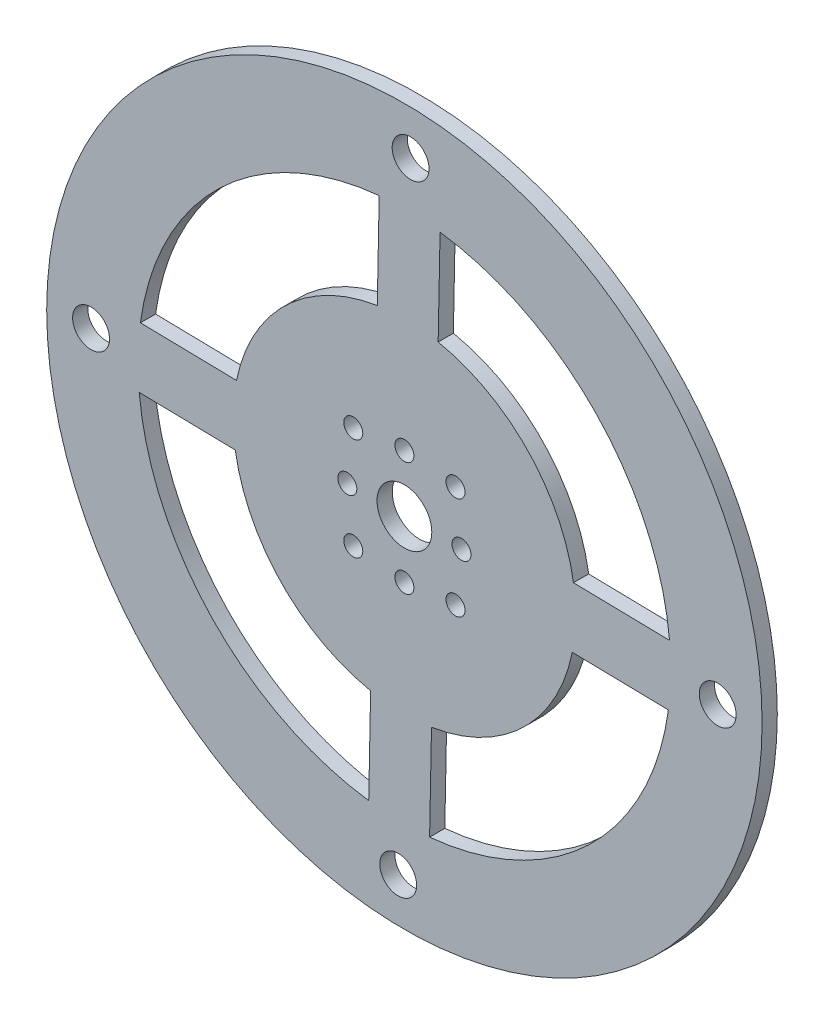
ISO-10303-21;
HEADER;
FILE_DESCRIPTION(('STEP AP214'),'2;1');
FILE_NAME('part.step','',(''),(''),'','','');
FILE_SCHEMA(('AUTOMOTIVE_DESIGN { 1 0 10303 214 1 1 1 1 }'));
ENDSEC;
DATA;
#1=APPLICATION_CONTEXT('core data for automotive mechanical design processes');
#2=APPLICATION_PROTOCOL_DEFINITION('international standard','automotive_design',2000,#1);
#3=PRODUCT_CONTEXT('',#1,'mechanical');
#4=PRODUCT('Part','Part','',(#3));
#5=PRODUCT_RELATED_PRODUCT_CATEGORY('part','',(#4));
#6=PRODUCT_DEFINITION_FORMATION('','',#4);
#7=PRODUCT_DEFINITION_CONTEXT('part definition',#1,'design');
#8=PRODUCT_DEFINITION('design','',#6,#7);
#9=PRODUCT_DEFINITION_SHAPE('','',#8);
#10=(LENGTH_UNIT() NAMED_UNIT(*) SI_UNIT(.MILLI.,.METRE.));
#11=(NAMED_UNIT(*) PLANE_ANGLE_UNIT() SI_UNIT($,.RADIAN.));
#12=(NAMED_UNIT(*) SI_UNIT($,.STERADIAN.) SOLID_ANGLE_UNIT());
#13=UNCERTAINTY_MEASURE_WITH_UNIT(LENGTH_MEASURE(1.E-05),#10,'distance_accuracy_value','');
#14=(GEOMETRIC_REPRESENTATION_CONTEXT(3) GLOBAL_UNCERTAINTY_ASSIGNED_CONTEXT((#13)) GLOBAL_UNIT_ASSIGNED_CONTEXT((#10,
#11,#12)) REPRESENTATION_CONTEXT('',''));
#15=CARTESIAN_POINT('',(0.,0.,0.));
#16=DIRECTION('',(0.,0.,1.));
#17=DIRECTION('',(1.,0.,0.));
#18=AXIS2_PLACEMENT_3D('',#15,#16,#17);
#19=CARTESIAN_POINT('',(0.,-1.2991317006536E-12,2.));
#20=DIRECTION('',(0.,0.,-1.));
#21=DIRECTION('',(-1.,0.,0.));
#22=AXIS2_PLACEMENT_3D('',#19,#20,#21);
#23=CYLINDRICAL_SURFACE('',#22,22.5);
#24=CARTESIAN_POINT('',(0.,-1.2991317006536E-12,0.));
#25=DIRECTION('',(0.,0.,1.));
#26=DIRECTION('',(1.,0.,0.));
#27=AXIS2_PLACEMENT_3D('',#24,#25,#26);
#28=CIRCLE('',#27,22.5);
#29=CARTESIAN_POINT('',(22.2163059498012,3.56170604413365,0.));
#30=VERTEX_POINT('',#29);
#31=CARTESIAN_POINT('',(4.43673200749201,22.0582276961146,0.));
#32=VERTEX_POINT('',#31);
#33=EDGE_CURVE('E326',#30,#32,#28,.T.);
#34=ORIENTED_EDGE('',*,*,#33,.T.);
#35=DIRECTION('',(0.,0.,-1.));
#36=VECTOR('',#35,1.);
#37=CARTESIAN_POINT('',(4.43673200749201,22.0582276961146,2.));
#38=LINE('',#37,#36);
#39=CARTESIAN_POINT('',(4.43673200749201,22.0582276961146,2.));
#40=VERTEX_POINT('',#39);
#41=EDGE_CURVE('E11',#40,#32,#38,.T.);
#42=ORIENTED_EDGE('',*,*,#41,.F.);
#43=CARTESIAN_POINT('',(0.,-1.2991317006536E-12,2.));
#44=DIRECTION('',(0.,0.,1.));
#45=DIRECTION('',(1.,0.,0.));
#46=AXIS2_PLACEMENT_3D('',#43,#44,#45);
#47=CIRCLE('',#46,22.5);
#48=CARTESIAN_POINT('',(22.2163059498012,3.56170604413365,2.));
#49=VERTEX_POINT('',#48);
#50=EDGE_CURVE('E186',#49,#40,#47,.T.);
#51=ORIENTED_EDGE('',*,*,#50,.F.);
#52=DIRECTION('',(0.,0.,-1.));
#53=VECTOR('',#52,1.);
#54=CARTESIAN_POINT('',(22.2163059498012,3.56170604413365,2.));
#55=LINE('',#54,#53);
#56=EDGE_CURVE('E69',#49,#30,#55,.T.);
#57=ORIENTED_EDGE('',*,*,#56,.T.);
#58=EDGE_LOOP('',(#34,#42,#51,#57));
#59=FACE_BOUND('',#58,.T.);
#60=ADVANCED_FACE('F49',(#59),#23,.T.);
#61=CARTESIAN_POINT('',(3.99921902581342,-0.0790391268426525,2.));
#62=DIRECTION('',(0.999804756453352,-0.0197597817106631,0.));
#63=DIRECTION('',(0.0197597817106631,0.999804756453352,0.));
#64=AXIS2_PLACEMENT_3D('',#61,#62,#63);
#65=PLANE('',#64);
#66=DIRECTION('',(-0.0197597817106631,-0.999804756453352,0.));
#67=VECTOR('',#66,1.);
#68=CARTESIAN_POINT('',(3.99921902581342,-0.0790391268426525,0.));
#69=LINE('',#68,#67);
#70=CARTESIAN_POINT('',(4.68628001922159,34.6848494242284,0.));
#71=VERTEX_POINT('',#70);
#72=EDGE_CURVE('E174',#71,#32,#69,.T.);
#73=ORIENTED_EDGE('',*,*,#72,.F.);
#74=DIRECTION('',(0.,0.,-1.));
#75=VECTOR('',#74,1.);
#76=CARTESIAN_POINT('',(4.68628001922159,34.6848494242284,2.));
#77=LINE('',#76,#75);
#78=CARTESIAN_POINT('',(4.68628001922159,34.6848494242284,2.));
#79=VERTEX_POINT('',#78);
#80=EDGE_CURVE('E60',#79,#71,#77,.T.);
#81=ORIENTED_EDGE('',*,*,#80,.F.);
#82=DIRECTION('',(-0.0197597817106631,-0.999804756453352,0.));
#83=VECTOR('',#82,1.);
#84=CARTESIAN_POINT('',(3.99921902581342,-0.0790391268426525,2.));
#85=LINE('',#84,#83);
#86=EDGE_CURVE('E172',#79,#40,#85,.T.);
#87=ORIENTED_EDGE('',*,*,#86,.T.);
#88=ORIENTED_EDGE('',*,*,#41,.T.);
#89=EDGE_LOOP('',(#73,#81,#87,#88));
#90=FACE_BOUND('',#89,.T.);
#91=ADVANCED_FACE('F171',(#90),#65,.T.);
#92=CARTESIAN_POINT('',(0.,0.,2.));
#93=DIRECTION('',(0.,0.,-1.));
#94=DIRECTION('',(-1.,0.,0.));
#95=AXIS2_PLACEMENT_3D('',#92,#93,#94);
#96=CYLINDRICAL_SURFACE('',#95,35.);
#97=CARTESIAN_POINT('',(0.,0.,0.));
#98=DIRECTION('',(0.,0.,1.));
#99=DIRECTION('',(1.,0.,0.));
#100=AXIS2_PLACEMENT_3D('',#97,#98,#99);
#101=CIRCLE('',#100,35.);
#102=CARTESIAN_POINT('',(34.8429276779144,3.31215803240416,0.));
#103=VERTEX_POINT('',#102);
#104=EDGE_CURVE('E316',#103,#71,#101,.T.);
#105=ORIENTED_EDGE('',*,*,#104,.F.);
#106=DIRECTION('',(0.,0.,-1.));
#107=VECTOR('',#106,1.);
#108=CARTESIAN_POINT('',(34.8429276779144,3.31215803240416,2.));
#109=LINE('',#108,#107);
#110=CARTESIAN_POINT('',(34.8429276779144,3.31215803240416,2.));
#111=VERTEX_POINT('',#110);
#112=EDGE_CURVE('E118',#111,#103,#109,.T.);
#113=ORIENTED_EDGE('',*,*,#112,.F.);
#114=CARTESIAN_POINT('',(0.,0.,2.));
#115=DIRECTION('',(0.,0.,1.));
#116=DIRECTION('',(1.,0.,0.));
#117=AXIS2_PLACEMENT_3D('',#114,#115,#116);
#118=CIRCLE('',#117,35.);
#119=EDGE_CURVE('E185',#111,#79,#118,.T.);
#120=ORIENTED_EDGE('',*,*,#119,.T.);
#121=ORIENTED_EDGE('',*,*,#80,.T.);
#122=EDGE_LOOP('',(#105,#113,#120,#121));
#123=FACE_BOUND('',#122,.T.);
#124=ADVANCED_FACE('F190',(#123),#96,.F.);
#125=CARTESIAN_POINT('',(-3.31215803240538,34.8429276779138,0.));
#126=VERTEX_POINT('',#125);
#127=CARTESIAN_POINT('',(-34.6848494242292,4.68628001922039,0.));
#128=VERTEX_POINT('',#127);
#129=EDGE_CURVE('E339',#126,#128,#101,.T.);
#130=ORIENTED_EDGE('',*,*,#129,.F.);
#131=DIRECTION('',(0.,0.,-1.));
#132=VECTOR('',#131,1.);
#133=CARTESIAN_POINT('',(-3.31215803240538,34.8429276779138,2.));
#134=LINE('',#133,#132);
#135=CARTESIAN_POINT('',(-3.31215803240538,34.8429276779138,2.));
#136=VERTEX_POINT('',#135);
#137=EDGE_CURVE('E406',#136,#126,#134,.T.);
#138=ORIENTED_EDGE('',*,*,#137,.F.);
#139=CARTESIAN_POINT('',(-34.6848494242292,4.68628001922039,2.));
#140=VERTEX_POINT('',#139);
#141=EDGE_CURVE('E194',#136,#140,#118,.T.);
#142=ORIENTED_EDGE('',*,*,#141,.T.);
#143=DIRECTION('',(0.,0.,-1.));
#144=VECTOR('',#143,1.);
#145=CARTESIAN_POINT('',(-34.6848494242292,4.68628001922039,2.));
#146=LINE('',#145,#144);
#147=EDGE_CURVE('E408',#140,#128,#146,.T.);
#148=ORIENTED_EDGE('',*,*,#147,.T.);
#149=EDGE_LOOP('',(#130,#138,#142,#148));
#150=FACE_BOUND('',#149,.T.);
#151=ADVANCED_FACE('F485',(#150),#96,.F.);
#152=CARTESIAN_POINT('',(-3.99921902581341,0.0790391268426523,2.));
#153=DIRECTION('',(-0.999804756453352,0.0197597817106631,0.));
#154=DIRECTION('',(-0.0197597817106631,-0.999804756453352,0.));
#155=AXIS2_PLACEMENT_3D('',#152,#153,#154);
#156=PLANE('',#155);
#157=DIRECTION('',(0.0197597817106631,0.999804756453352,0.));
#158=VECTOR('',#157,1.);
#159=CARTESIAN_POINT('',(-3.99921902581341,0.0790391268426523,0.));
#160=LINE('',#159,#158);
#161=CARTESIAN_POINT('',(-3.56170604413482,22.2163059497999,0.));
#162=VERTEX_POINT('',#161);
#163=EDGE_CURVE('E340',#162,#126,#160,.T.);
#164=ORIENTED_EDGE('',*,*,#163,.F.);
#165=DIRECTION('',(0.,0.,-1.));
#166=VECTOR('',#165,1.);
#167=CARTESIAN_POINT('',(-3.56170604413482,22.2163059497999,2.));
#168=LINE('',#167,#166);
#169=CARTESIAN_POINT('',(-3.56170604413482,22.2163059497999,2.));
#170=VERTEX_POINT('',#169);
#171=EDGE_CURVE('E414',#170,#162,#168,.T.);
#172=ORIENTED_EDGE('',*,*,#171,.F.);
#173=DIRECTION('',(0.0197597817106631,0.999804756453352,0.));
#174=VECTOR('',#173,1.);
#175=CARTESIAN_POINT('',(-3.99921902581341,0.0790391268426523,2.));
#176=LINE('',#175,#174);
#177=EDGE_CURVE('E205',#170,#136,#176,.T.);
#178=ORIENTED_EDGE('',*,*,#177,.T.);
#179=ORIENTED_EDGE('',*,*,#137,.T.);
#180=EDGE_LOOP('',(#164,#172,#178,#179));
#181=FACE_BOUND('',#180,.T.);
#182=ADVANCED_FACE('F477',(#181),#156,.T.);
#183=CARTESIAN_POINT('',(-22.0582276961159,4.43673200749088,0.));
#184=VERTEX_POINT('',#183);
#185=EDGE_CURVE('E344',#162,#184,#28,.T.);
#186=ORIENTED_EDGE('',*,*,#185,.T.);
#187=DIRECTION('',(0.,0.,-1.));
#188=VECTOR('',#187,1.);
#189=CARTESIAN_POINT('',(-22.0582276961159,4.43673200749088,2.));
#190=LINE('',#189,#188);
#191=CARTESIAN_POINT('',(-22.0582276961159,4.43673200749088,2.));
#192=VERTEX_POINT('',#191);
#193=EDGE_CURVE('E410',#192,#184,#190,.T.);
#194=ORIENTED_EDGE('',*,*,#193,.F.);
#195=EDGE_CURVE('E251',#170,#192,#47,.T.);
#196=ORIENTED_EDGE('',*,*,#195,.F.);
#197=ORIENTED_EDGE('',*,*,#171,.T.);
#198=EDGE_LOOP('',(#186,#194,#196,#197));
#199=FACE_BOUND('',#198,.T.);
#200=ADVANCED_FACE('F466',(#199),#23,.T.);
#201=CARTESIAN_POINT('',(-34.8429276779144,-3.31215803240644,0.));
#202=VERTEX_POINT('',#201);
#203=CARTESIAN_POINT('',(-4.68628001922146,-34.6848494242298,0.));
#204=VERTEX_POINT('',#203);
#205=EDGE_CURVE('E317',#202,#204,#101,.T.);
#206=ORIENTED_EDGE('',*,*,#205,.F.);
#207=DIRECTION('',(0.,0.,-1.));
#208=VECTOR('',#207,1.);
#209=CARTESIAN_POINT('',(-34.8429276779144,-3.31215803240644,2.));
#210=LINE('',#209,#208);
#211=CARTESIAN_POINT('',(-34.8429276779144,-3.31215803240644,2.));
#212=VERTEX_POINT('',#211);
#213=EDGE_CURVE('E411',#212,#202,#210,.T.);
#214=ORIENTED_EDGE('',*,*,#213,.F.);
#215=CARTESIAN_POINT('',(-4.68628001922146,-34.6848494242298,2.));
#216=VERTEX_POINT('',#215);
#217=EDGE_CURVE('E207',#212,#216,#118,.T.);
#218=ORIENTED_EDGE('',*,*,#217,.T.);
#219=DIRECTION('',(0.,0.,-1.));
#220=VECTOR('',#219,1.);
#221=CARTESIAN_POINT('',(-4.68628001922146,-34.6848494242298,2.));
#222=LINE('',#221,#220);
#223=EDGE_CURVE('E419',#216,#204,#222,.T.);
#224=ORIENTED_EDGE('',*,*,#223,.T.);
#225=EDGE_LOOP('',(#206,#214,#218,#224));
#226=FACE_BOUND('',#225,.T.);
#227=ADVANCED_FACE('F476',(#226),#96,.F.);
#228=CARTESIAN_POINT('',(-0.0790391268426754,-3.99921902581456,2.));
#229=DIRECTION('',(-0.0197597817106632,-0.999804756453352,0.));
#230=DIRECTION('',(0.999804756453352,-0.0197597817106632,0.));
#231=AXIS2_PLACEMENT_3D('',#228,#229,#230);
#232=PLANE('',#231);
#233=DIRECTION('',(-0.999804756453352,0.0197597817106632,0.));
#234=VECTOR('',#233,1.);
#235=CARTESIAN_POINT('',(-0.0790391268426754,-3.99921902581456,0.));
#236=LINE('',#235,#234);
#237=CARTESIAN_POINT('',(-22.2163059498013,-3.56170604413594,0.));
#238=VERTEX_POINT('',#237);
#239=EDGE_CURVE('E331',#238,#202,#236,.T.);
#240=ORIENTED_EDGE('',*,*,#239,.F.);
#241=DIRECTION('',(0.,0.,-1.));
#242=VECTOR('',#241,1.);
#243=CARTESIAN_POINT('',(-22.2163059498013,-3.56170604413594,2.));
#244=LINE('',#243,#242);
#245=CARTESIAN_POINT('',(-22.2163059498013,-3.56170604413594,2.));
#246=VERTEX_POINT('',#245);
#247=EDGE_CURVE('E425',#246,#238,#244,.T.);
#248=ORIENTED_EDGE('',*,*,#247,.F.);
#249=DIRECTION('',(-0.999804756453352,0.0197597817106632,0.));
#250=VECTOR('',#249,1.);
#251=CARTESIAN_POINT('',(-0.0790391268426754,-3.99921902581456,2.));
#252=LINE('',#251,#250);
#253=EDGE_CURVE('E223',#246,#212,#252,.T.);
#254=ORIENTED_EDGE('',*,*,#253,.T.);
#255=ORIENTED_EDGE('',*,*,#213,.T.);
#256=EDGE_LOOP('',(#240,#248,#254,#255));
#257=FACE_BOUND('',#256,.T.);
#258=ADVANCED_FACE('F483',(#257),#232,.T.);
#259=CARTESIAN_POINT('',(-4.43673200749204,-22.0582276961172,0.));
#260=VERTEX_POINT('',#259);
#261=EDGE_CURVE('E327',#238,#260,#28,.T.);
#262=ORIENTED_EDGE('',*,*,#261,.T.);
#263=DIRECTION('',(0.,0.,-1.));
#264=VECTOR('',#263,1.);
#265=CARTESIAN_POINT('',(-4.43673200749204,-22.0582276961172,2.));
#266=LINE('',#265,#264);
#267=CARTESIAN_POINT('',(-4.43673200749204,-22.0582276961172,2.));
#268=VERTEX_POINT('',#267);
#269=EDGE_CURVE('E422',#268,#260,#266,.T.);
#270=ORIENTED_EDGE('',*,*,#269,.F.);
#271=EDGE_CURVE('E233',#246,#268,#47,.T.);
#272=ORIENTED_EDGE('',*,*,#271,.F.);
#273=ORIENTED_EDGE('',*,*,#247,.T.);
#274=EDGE_LOOP('',(#262,#270,#272,#273));
#275=FACE_BOUND('',#274,.T.);
#276=ADVANCED_FACE('F474',(#275),#23,.T.);
#277=CARTESIAN_POINT('',(3.31215803240521,-34.8429276779151,0.));
#278=VERTEX_POINT('',#277);
#279=CARTESIAN_POINT('',(34.684849424229,-4.68628001922266,0.));
#280=VERTEX_POINT('',#279);
#281=EDGE_CURVE('E312',#278,#280,#101,.T.);
#282=ORIENTED_EDGE('',*,*,#281,.F.);
#283=DIRECTION('',(0.,0.,-1.));
#284=VECTOR('',#283,1.);
#285=CARTESIAN_POINT('',(3.31215803240521,-34.8429276779151,2.));
#286=LINE('',#285,#284);
#287=CARTESIAN_POINT('',(3.31215803240521,-34.8429276779151,2.));
#288=VERTEX_POINT('',#287);
#289=EDGE_CURVE('E53',#288,#278,#286,.T.);
#290=ORIENTED_EDGE('',*,*,#289,.F.);
#291=CARTESIAN_POINT('',(34.684849424229,-4.68628001922266,2.));
#292=VERTEX_POINT('',#291);
#293=EDGE_CURVE('E195',#288,#292,#118,.T.);
#294=ORIENTED_EDGE('',*,*,#293,.T.);
#295=DIRECTION('',(0.,0.,-1.));
#296=VECTOR('',#295,1.);
#297=CARTESIAN_POINT('',(34.684849424229,-4.68628001922266,2.));
#298=LINE('',#297,#296);
#299=EDGE_CURVE('E311',#292,#280,#298,.T.);
#300=ORIENTED_EDGE('',*,*,#299,.T.);
#301=EDGE_LOOP('',(#282,#290,#294,#300));
#302=FACE_BOUND('',#301,.T.);
#303=ADVANCED_FACE('F443',(#302),#96,.F.);
#304=CARTESIAN_POINT('',(3.99921902581341,-0.0790391268426524,2.));
#305=DIRECTION('',(0.999804756453352,-0.0197597817106631,0.));
#306=DIRECTION('',(0.0197597817106631,0.999804756453352,0.));
#307=AXIS2_PLACEMENT_3D('',#304,#305,#306);
#308=PLANE('',#307);
#309=DIRECTION('',(-0.0197597817106631,-0.999804756453352,0.));
#310=VECTOR('',#309,1.);
#311=CARTESIAN_POINT('',(3.99921902581341,-0.0790391268426524,0.));
#312=LINE('',#311,#310);
#313=CARTESIAN_POINT('',(3.56170604413478,-22.2163059498025,0.));
#314=VERTEX_POINT('',#313);
#315=EDGE_CURVE('E315',#314,#278,#312,.T.);
#316=ORIENTED_EDGE('',*,*,#315,.F.);
#317=DIRECTION('',(0.,0.,-1.));
#318=VECTOR('',#317,1.);
#319=CARTESIAN_POINT('',(3.56170604413478,-22.2163059498025,2.));
#320=LINE('',#319,#318);
#321=CARTESIAN_POINT('',(3.56170604413478,-22.2163059498025,2.));
#322=VERTEX_POINT('',#321);
#323=EDGE_CURVE('E434',#322,#314,#320,.T.);
#324=ORIENTED_EDGE('',*,*,#323,.F.);
#325=DIRECTION('',(-0.0197597817106631,-0.999804756453352,0.));
#326=VECTOR('',#325,1.);
#327=CARTESIAN_POINT('',(3.99921902581341,-0.0790391268426524,2.));
#328=LINE('',#327,#326);
#329=EDGE_CURVE('E209',#322,#288,#328,.T.);
#330=ORIENTED_EDGE('',*,*,#329,.T.);
#331=ORIENTED_EDGE('',*,*,#289,.T.);
#332=EDGE_LOOP('',(#316,#324,#330,#331));
#333=FACE_BOUND('',#332,.T.);
#334=ADVANCED_FACE('F51',(#333),#308,.T.);
#335=CARTESIAN_POINT('',(22.0582276961159,-4.43673200749317,0.));
#336=VERTEX_POINT('',#335);
#337=EDGE_CURVE('E321',#314,#336,#28,.T.);
#338=ORIENTED_EDGE('',*,*,#337,.T.);
#339=DIRECTION('',(0.,0.,-1.));
#340=VECTOR('',#339,1.);
#341=CARTESIAN_POINT('',(22.0582276961159,-4.43673200749317,2.));
#342=LINE('',#341,#340);
#343=CARTESIAN_POINT('',(22.0582276961159,-4.43673200749317,2.));
#344=VERTEX_POINT('',#343);
#345=EDGE_CURVE('E432',#344,#336,#342,.T.);
#346=ORIENTED_EDGE('',*,*,#345,.F.);
#347=EDGE_CURVE('E216',#322,#344,#47,.T.);
#348=ORIENTED_EDGE('',*,*,#347,.F.);
#349=ORIENTED_EDGE('',*,*,#323,.T.);
#350=EDGE_LOOP('',(#338,#346,#348,#349));
#351=FACE_BOUND('',#350,.T.);
#352=ADVANCED_FACE('F449',(#351),#23,.T.);
#353=CARTESIAN_POINT('',(-41.1669608469668,0.813609011935407,2.));
#354=DIRECTION('',(0.,0.,-1.));
#355=DIRECTION('',(-1.,0.,0.));
#356=AXIS2_PLACEMENT_3D('',#353,#354,#355);
#357=CYLINDRICAL_SURFACE('',#356,2.425);
#358=CARTESIAN_POINT('',(-41.1669608469668,0.813609011935407,2.));
#359=DIRECTION('',(0.,0.,1.));
#360=DIRECTION('',(1.,0.,0.));
#361=AXIS2_PLACEMENT_3D('',#358,#359,#360);
#362=CIRCLE('',#361,2.425);
#363=CARTESIAN_POINT('',(-38.7419608469668,0.813609011935407,2.));
#364=VERTEX_POINT('',#363);
#365=EDGE_CURVE('E303',#364,#364,#362,.T.);
#366=ORIENTED_EDGE('',*,*,#365,.T.);
#367=EDGE_LOOP('',(#366));
#368=FACE_BOUND('',#367,.T.);
#369=CARTESIAN_POINT('',(-41.1669608469668,0.813609011935407,0.));
#370=DIRECTION('',(0.,0.,1.));
#371=DIRECTION('',(1.,0.,0.));
#372=AXIS2_PLACEMENT_3D('',#369,#370,#371);
#373=CIRCLE('',#372,2.425);
#374=CARTESIAN_POINT('',(-38.7419608469668,0.813609011935407,0.));
#375=VERTEX_POINT('',#374);
#376=EDGE_CURVE('E219',#375,#375,#373,.T.);
#377=ORIENTED_EDGE('',*,*,#376,.F.);
#378=EDGE_LOOP('',(#377));
#379=FACE_BOUND('',#378,.T.);
#380=ADVANCED_FACE('F473',(#368,#379),#357,.F.);
#381=CARTESIAN_POINT('',(41.1669608469668,-0.813609011938273,2.));
#382=DIRECTION('',(0.,0.,-1.));
#383=DIRECTION('',(-1.,0.,0.));
#384=AXIS2_PLACEMENT_3D('',#381,#382,#383);
#385=CYLINDRICAL_SURFACE('',#384,2.425);
#386=CARTESIAN_POINT('',(41.1669608469668,-0.813609011938273,2.));
#387=DIRECTION('',(0.,0.,1.));
#388=DIRECTION('',(1.,0.,0.));
#389=AXIS2_PLACEMENT_3D('',#386,#387,#388);
#390=CIRCLE('',#389,2.425);
#391=CARTESIAN_POINT('',(43.5919608469667,-0.813609011938273,2.));
#392=VERTEX_POINT('',#391);
#393=EDGE_CURVE('E299',#392,#392,#390,.T.);
#394=ORIENTED_EDGE('',*,*,#393,.T.);
#395=EDGE_LOOP('',(#394));
#396=FACE_BOUND('',#395,.T.);
#397=CARTESIAN_POINT('',(41.1669608469668,-0.813609011938273,0.));
#398=DIRECTION('',(0.,0.,1.));
#399=DIRECTION('',(1.,0.,0.));
#400=AXIS2_PLACEMENT_3D('',#397,#398,#399);
#401=CIRCLE('',#400,2.425);
#402=CARTESIAN_POINT('',(43.5919608469667,-0.813609011938273,0.));
#403=VERTEX_POINT('',#402);
#404=EDGE_CURVE('E397',#403,#403,#401,.T.);
#405=ORIENTED_EDGE('',*,*,#404,.F.);
#406=EDGE_LOOP('',(#405));
#407=FACE_BOUND('',#406,.T.);
#408=ADVANCED_FACE('F653',(#396,#407),#385,.F.);
#409=CARTESIAN_POINT('',(0.81360901193682,41.1669608469655,2.));
#410=DIRECTION('',(0.,0.,-1.));
#411=DIRECTION('',(-1.,0.,0.));
#412=AXIS2_PLACEMENT_3D('',#409,#410,#411);
#413=CYLINDRICAL_SURFACE('',#412,2.42499999999999);
#414=CARTESIAN_POINT('',(0.81360901193682,41.1669608469655,2.));
#415=DIRECTION('',(0.,0.,1.));
#416=DIRECTION('',(1.,0.,0.));
#417=AXIS2_PLACEMENT_3D('',#414,#415,#416);
#418=CIRCLE('',#417,2.42499999999999);
#419=CARTESIAN_POINT('',(3.23860901193681,41.1669608469655,2.));
#420=VERTEX_POINT('',#419);
#421=EDGE_CURVE('E295',#420,#420,#418,.T.);
#422=ORIENTED_EDGE('',*,*,#421,.T.);
#423=EDGE_LOOP('',(#422));
#424=FACE_BOUND('',#423,.T.);
#425=CARTESIAN_POINT('',(0.81360901193682,41.1669608469655,0.));
#426=DIRECTION('',(0.,0.,1.));
#427=DIRECTION('',(1.,0.,0.));
#428=AXIS2_PLACEMENT_3D('',#425,#426,#427);
#429=CIRCLE('',#428,2.42499999999999);
#430=CARTESIAN_POINT('',(3.23860901193681,41.1669608469655,0.));
#431=VERTEX_POINT('',#430);
#432=EDGE_CURVE('E393',#431,#431,#429,.T.);
#433=ORIENTED_EDGE('',*,*,#432,.F.);
#434=EDGE_LOOP('',(#433));
#435=FACE_BOUND('',#434,.T.);
#436=ADVANCED_FACE('F657',(#424,#435),#413,.F.);
#437=CARTESIAN_POINT('',(-0.813609011936573,-41.1669608469681,2.));
#438=DIRECTION('',(0.,0.,-1.));
#439=DIRECTION('',(-1.,0.,0.));
#440=AXIS2_PLACEMENT_3D('',#437,#438,#439);
#441=CYLINDRICAL_SURFACE('',#440,2.42499999999999);
#442=CARTESIAN_POINT('',(-0.813609011936573,-41.1669608469681,2.));
#443=DIRECTION('',(0.,0.,1.));
#444=DIRECTION('',(1.,0.,0.));
#445=AXIS2_PLACEMENT_3D('',#442,#443,#444);
#446=CIRCLE('',#445,2.42499999999999);
#447=CARTESIAN_POINT('',(1.61139098806342,-41.1669608469681,2.));
#448=VERTEX_POINT('',#447);
#449=EDGE_CURVE('E291',#448,#448,#446,.T.);
#450=ORIENTED_EDGE('',*,*,#449,.T.);
#451=EDGE_LOOP('',(#450));
#452=FACE_BOUND('',#451,.T.);
#453=CARTESIAN_POINT('',(-0.813609011936573,-41.1669608469681,0.));
#454=DIRECTION('',(0.,0.,1.));
#455=DIRECTION('',(1.,0.,0.));
#456=AXIS2_PLACEMENT_3D('',#453,#454,#455);
#457=CIRCLE('',#456,2.42499999999999);
#458=CARTESIAN_POINT('',(1.61139098806342,-41.1669608469681,0.));
#459=VERTEX_POINT('',#458);
#460=EDGE_CURVE('E389',#459,#459,#457,.T.);
#461=ORIENTED_EDGE('',*,*,#460,.F.);
#462=EDGE_LOOP('',(#461));
#463=FACE_BOUND('',#462,.T.);
#464=ADVANCED_FACE('F661',(#452,#463),#441,.F.);
#465=CARTESIAN_POINT('',(0.,-1.2991317006536E-12,2.));
#466=DIRECTION('',(0.,0.,-1.));
#467=DIRECTION('',(-1.,0.,0.));
#468=AXIS2_PLACEMENT_3D('',#465,#466,#467);
#469=CYLINDRICAL_SURFACE('',#468,3.6);
#470=CARTESIAN_POINT('',(0.,-1.2991317006536E-12,2.));
#471=DIRECTION('',(0.,0.,1.));
#472=DIRECTION('',(1.,0.,0.));
#473=AXIS2_PLACEMENT_3D('',#470,#471,#472);
#474=CIRCLE('',#473,3.6);
#475=CARTESIAN_POINT('',(3.59999999999997,-1.2991317006536E-12,2.));
#476=VERTEX_POINT('',#475);
#477=EDGE_CURVE('E287',#476,#476,#474,.F.);
#478=ORIENTED_EDGE('',*,*,#477,.F.);
#479=EDGE_LOOP('',(#478));
#480=FACE_BOUND('',#479,.T.);
#481=CARTESIAN_POINT('',(0.,-1.2991317006536E-12,0.));
#482=DIRECTION('',(0.,0.,1.));
#483=DIRECTION('',(1.,0.,0.));
#484=AXIS2_PLACEMENT_3D('',#481,#482,#483);
#485=CIRCLE('',#484,3.6);
#486=CARTESIAN_POINT('',(3.59999999999997,-1.2991317006536E-12,0.));
#487=VERTEX_POINT('',#486);
#488=EDGE_CURVE('E386',#487,#487,#485,.F.);
#489=ORIENTED_EDGE('',*,*,#488,.T.);
#490=EDGE_LOOP('',(#489));
#491=FACE_BOUND('',#490,.T.);
#492=ADVANCED_FACE('F665',(#480,#491),#469,.F.);
#493=CARTESIAN_POINT('',(6.71751442127212,6.71751442127096,2.));
#494=DIRECTION('',(0.,0.,-1.));
#495=DIRECTION('',(-1.,0.,0.));
#496=AXIS2_PLACEMENT_3D('',#493,#494,#495);
#497=CYLINDRICAL_SURFACE('',#496,1.25);
#498=CARTESIAN_POINT('',(6.71751442127212,6.71751442127096,2.));
#499=DIRECTION('',(0.,0.,1.));
#500=DIRECTION('',(1.,0.,0.));
#501=AXIS2_PLACEMENT_3D('',#498,#499,#500);
#502=CIRCLE('',#501,1.25);
#503=CARTESIAN_POINT('',(7.96751442127212,6.71751442127096,2.));
#504=VERTEX_POINT('',#503);
#505=EDGE_CURVE('E283',#504,#504,#502,.F.);
#506=ORIENTED_EDGE('',*,*,#505,.F.);
#507=EDGE_LOOP('',(#506));
#508=FACE_BOUND('',#507,.T.);
#509=CARTESIAN_POINT('',(6.71751442127212,6.71751442127096,0.));
#510=DIRECTION('',(0.,0.,1.));
#511=DIRECTION('',(1.,0.,0.));
#512=AXIS2_PLACEMENT_3D('',#509,#510,#511);
#513=CIRCLE('',#512,1.25);
#514=CARTESIAN_POINT('',(7.96751442127212,6.71751442127096,0.));
#515=VERTEX_POINT('',#514);
#516=EDGE_CURVE('E382',#515,#515,#513,.F.);
#517=ORIENTED_EDGE('',*,*,#516,.T.);
#518=EDGE_LOOP('',(#517));
#519=FACE_BOUND('',#518,.T.);
#520=ADVANCED_FACE('F669',(#508,#519),#497,.F.);
#521=CARTESIAN_POINT('',(-7.50000000000002,-1.33227359266214E-12,2.));
#522=DIRECTION('',(0.,0.,-1.));
#523=DIRECTION('',(-1.,0.,0.));
#524=AXIS2_PLACEMENT_3D('',#521,#522,#523);
#525=CYLINDRICAL_SURFACE('',#524,1.25);
#526=CARTESIAN_POINT('',(-7.50000000000002,-1.33227359266214E-12,2.));
#527=DIRECTION('',(0.,0.,1.));
#528=DIRECTION('',(1.,0.,0.));
#529=AXIS2_PLACEMENT_3D('',#526,#527,#528);
#530=CIRCLE('',#529,1.25);
#531=CARTESIAN_POINT('',(-6.25000000000003,-1.33227359266214E-12,2.));
#532=VERTEX_POINT('',#531);
#533=EDGE_CURVE('E279',#532,#532,#530,.F.);
#534=ORIENTED_EDGE('',*,*,#533,.F.);
#535=EDGE_LOOP('',(#534));
#536=FACE_BOUND('',#535,.T.);
#537=CARTESIAN_POINT('',(-7.50000000000002,-1.33227359266214E-12,0.));
#538=DIRECTION('',(0.,0.,1.));
#539=DIRECTION('',(1.,0.,0.));
#540=AXIS2_PLACEMENT_3D('',#537,#538,#539);
#541=CIRCLE('',#540,1.25);
#542=CARTESIAN_POINT('',(-6.25000000000003,-1.33227359266214E-12,0.));
#543=VERTEX_POINT('',#542);
#544=EDGE_CURVE('E378',#543,#543,#541,.F.);
#545=ORIENTED_EDGE('',*,*,#544,.T.);
#546=EDGE_LOOP('',(#545));
#547=FACE_BOUND('',#546,.T.);
#548=ADVANCED_FACE('F673',(#536,#547),#525,.F.);
#549=CARTESIAN_POINT('',(6.71751442127223,-6.71751442127344,2.));
#550=DIRECTION('',(0.,0.,-1.));
#551=DIRECTION('',(-1.,0.,0.));
#552=AXIS2_PLACEMENT_3D('',#549,#550,#551);
#553=CYLINDRICAL_SURFACE('',#552,1.25);
#554=CARTESIAN_POINT('',(6.71751442127223,-6.71751442127344,2.));
#555=DIRECTION('',(0.,0.,1.));
#556=DIRECTION('',(1.,0.,0.));
#557=AXIS2_PLACEMENT_3D('',#554,#555,#556);
#558=CIRCLE('',#557,1.25);
#559=CARTESIAN_POINT('',(7.96751442127223,-6.71751442127344,2.));
#560=VERTEX_POINT('',#559);
#561=EDGE_CURVE('E275',#560,#560,#558,.F.);
#562=ORIENTED_EDGE('',*,*,#561,.F.);
#563=EDGE_LOOP('',(#562));
#564=FACE_BOUND('',#563,.T.);
#565=CARTESIAN_POINT('',(6.71751442127223,-6.71751442127344,0.));
#566=DIRECTION('',(0.,0.,1.));
#567=DIRECTION('',(1.,0.,0.));
#568=AXIS2_PLACEMENT_3D('',#565,#566,#567);
#569=CIRCLE('',#568,1.25);
#570=CARTESIAN_POINT('',(7.96751442127223,-6.71751442127344,0.));
#571=VERTEX_POINT('',#570);
#572=EDGE_CURVE('E374',#571,#571,#569,.F.);
#573=ORIENTED_EDGE('',*,*,#572,.T.);
#574=EDGE_LOOP('',(#573));
#575=FACE_BOUND('',#574,.T.);
#576=ADVANCED_FACE('F677',(#564,#575),#553,.F.);
#577=CARTESIAN_POINT('',(-6.71751442127217,-6.71751442127356,2.));
#578=DIRECTION('',(0.,0.,-1.));
#579=DIRECTION('',(-1.,0.,0.));
#580=AXIS2_PLACEMENT_3D('',#577,#578,#579);
#581=CYLINDRICAL_SURFACE('',#580,1.25);
#582=CARTESIAN_POINT('',(-6.71751442127217,-6.71751442127356,2.));
#583=DIRECTION('',(0.,0.,1.));
#584=DIRECTION('',(1.,0.,0.));
#585=AXIS2_PLACEMENT_3D('',#582,#583,#584);
#586=CIRCLE('',#585,1.25);
#587=CARTESIAN_POINT('',(-5.46751442127217,-6.71751442127356,2.));
#588=VERTEX_POINT('',#587);
#589=EDGE_CURVE('E271',#588,#588,#586,.F.);
#590=ORIENTED_EDGE('',*,*,#589,.F.);
#591=EDGE_LOOP('',(#590));
#592=FACE_BOUND('',#591,.T.);
#593=CARTESIAN_POINT('',(-6.71751442127217,-6.71751442127356,0.));
#594=DIRECTION('',(0.,0.,1.));
#595=DIRECTION('',(1.,0.,0.));
#596=AXIS2_PLACEMENT_3D('',#593,#594,#595);
#597=CIRCLE('',#596,1.25);
#598=CARTESIAN_POINT('',(-5.46751442127217,-6.71751442127356,0.));
#599=VERTEX_POINT('',#598);
#600=EDGE_CURVE('E370',#599,#599,#597,.F.);
#601=ORIENTED_EDGE('',*,*,#600,.T.);
#602=EDGE_LOOP('',(#601));
#603=FACE_BOUND('',#602,.T.);
#604=ADVANCED_FACE('F604',(#592,#603),#581,.F.);
#605=CARTESIAN_POINT('',(-6.71751442127228,6.71751442127085,2.));
#606=DIRECTION('',(0.,0.,-1.));
#607=DIRECTION('',(-1.,0.,0.));
#608=AXIS2_PLACEMENT_3D('',#605,#606,#607);
#609=CYLINDRICAL_SURFACE('',#608,1.25);
#610=CARTESIAN_POINT('',(-6.71751442127228,6.71751442127085,2.));
#611=DIRECTION('',(0.,0.,1.));
#612=DIRECTION('',(1.,0.,0.));
#613=AXIS2_PLACEMENT_3D('',#610,#611,#612);
#614=CIRCLE('',#613,1.25);
#615=CARTESIAN_POINT('',(-5.46751442127228,6.71751442127085,2.));
#616=VERTEX_POINT('',#615);
#617=EDGE_CURVE('E200',#616,#616,#614,.F.);
#618=ORIENTED_EDGE('',*,*,#617,.F.);
#619=EDGE_LOOP('',(#618));
#620=FACE_BOUND('',#619,.T.);
#621=CARTESIAN_POINT('',(-6.71751442127228,6.71751442127085,0.));
#622=DIRECTION('',(0.,0.,1.));
#623=DIRECTION('',(1.,0.,0.));
#624=AXIS2_PLACEMENT_3D('',#621,#622,#623);
#625=CIRCLE('',#624,1.25);
#626=CARTESIAN_POINT('',(-5.46751442127228,6.71751442127085,0.));
#627=VERTEX_POINT('',#626);
#628=EDGE_CURVE('E366',#627,#627,#625,.F.);
#629=ORIENTED_EDGE('',*,*,#628,.T.);
#630=EDGE_LOOP('',(#629));
#631=FACE_BOUND('',#630,.T.);
#632=ADVANCED_FACE('F596',(#620,#631),#609,.F.);
#633=CARTESIAN_POINT('',(0.0790391268426299,3.99921902581227,2.));
#634=DIRECTION('',(0.0197597817106631,0.999804756453352,0.));
#635=DIRECTION('',(-0.999804756453352,0.0197597817106631,0.));
#636=AXIS2_PLACEMENT_3D('',#633,#634,#635);
#637=PLANE('',#636);
#638=DIRECTION('',(0.999804756453352,-0.0197597817106631,0.));
#639=VECTOR('',#638,1.);
#640=CARTESIAN_POINT('',(0.0790391268426299,3.99921902581227,0.));
#641=LINE('',#640,#639);
#642=EDGE_CURVE('E362',#30,#103,#641,.T.);
#643=ORIENTED_EDGE('',*,*,#642,.F.);
#644=ORIENTED_EDGE('',*,*,#56,.F.);
#645=DIRECTION('',(0.999804756453352,-0.0197597817106631,0.));
#646=VECTOR('',#645,1.);
#647=CARTESIAN_POINT('',(0.0790391268426299,3.99921902581227,2.));
#648=LINE('',#647,#646);
#649=EDGE_CURVE('E192',#49,#111,#648,.T.);
#650=ORIENTED_EDGE('',*,*,#649,.T.);
#651=ORIENTED_EDGE('',*,*,#112,.T.);
#652=EDGE_LOOP('',(#643,#644,#650,#651));
#653=FACE_BOUND('',#652,.T.);
#654=ADVANCED_FACE('F593',(#653),#637,.T.);
#655=CARTESIAN_POINT('',(0.,-7.5000000000013,2.));
#656=DIRECTION('',(0.,0.,-1.));
#657=DIRECTION('',(-1.,0.,0.));
#658=AXIS2_PLACEMENT_3D('',#655,#656,#657);
#659=CYLINDRICAL_SURFACE('',#658,1.25);
#660=CARTESIAN_POINT('',(0.,-7.5000000000013,2.));
#661=DIRECTION('',(0.,0.,1.));
#662=DIRECTION('',(1.,0.,0.));
#663=AXIS2_PLACEMENT_3D('',#660,#661,#662);
#664=CIRCLE('',#663,1.25);
#665=CARTESIAN_POINT('',(1.25000000000002,-7.5000000000013,2.));
#666=VERTEX_POINT('',#665);
#667=EDGE_CURVE('E264',#666,#666,#664,.F.);
#668=ORIENTED_EDGE('',*,*,#667,.F.);
#669=EDGE_LOOP('',(#668));
#670=FACE_BOUND('',#669,.T.);
#671=CARTESIAN_POINT('',(0.,-7.5000000000013,0.));
#672=DIRECTION('',(0.,0.,1.));
#673=DIRECTION('',(1.,0.,0.));
#674=AXIS2_PLACEMENT_3D('',#671,#672,#673);
#675=CIRCLE('',#674,1.25);
#676=CARTESIAN_POINT('',(1.25000000000002,-7.5000000000013,0.));
#677=VERTEX_POINT('',#676);
#678=EDGE_CURVE('E357',#677,#677,#675,.F.);
#679=ORIENTED_EDGE('',*,*,#678,.T.);
#680=EDGE_LOOP('',(#679));
#681=FACE_BOUND('',#680,.T.);
#682=ADVANCED_FACE('F595',(#670,#681),#659,.F.);
#683=CARTESIAN_POINT('',(0.,7.4999999999987,2.));
#684=DIRECTION('',(0.,0.,-1.));
#685=DIRECTION('',(-1.,0.,0.));
#686=AXIS2_PLACEMENT_3D('',#683,#684,#685);
#687=CYLINDRICAL_SURFACE('',#686,1.25);
#688=CARTESIAN_POINT('',(0.,7.4999999999987,2.));
#689=DIRECTION('',(0.,0.,1.));
#690=DIRECTION('',(1.,0.,0.));
#691=AXIS2_PLACEMENT_3D('',#688,#689,#690);
#692=CIRCLE('',#691,1.25);
#693=CARTESIAN_POINT('',(1.24999999999993,7.4999999999987,2.));
#694=VERTEX_POINT('',#693);
#695=EDGE_CURVE('E260',#694,#694,#692,.F.);
#696=ORIENTED_EDGE('',*,*,#695,.F.);
#697=EDGE_LOOP('',(#696));
#698=FACE_BOUND('',#697,.T.);
#699=CARTESIAN_POINT('',(0.,7.4999999999987,0.));
#700=DIRECTION('',(0.,0.,1.));
#701=DIRECTION('',(1.,0.,0.));
#702=AXIS2_PLACEMENT_3D('',#699,#700,#701);
#703=CIRCLE('',#702,1.25);
#704=CARTESIAN_POINT('',(1.24999999999993,7.4999999999987,0.));
#705=VERTEX_POINT('',#704);
#706=EDGE_CURVE('E353',#705,#705,#703,.F.);
#707=ORIENTED_EDGE('',*,*,#706,.T.);
#708=EDGE_LOOP('',(#707));
#709=FACE_BOUND('',#708,.T.);
#710=ADVANCED_FACE('F602',(#698,#709),#687,.F.);
#711=CARTESIAN_POINT('',(7.49999999999997,-1.25211202083725E-12,2.));
#712=DIRECTION('',(0.,0.,-1.));
#713=DIRECTION('',(-1.,0.,0.));
#714=AXIS2_PLACEMENT_3D('',#711,#712,#713);
#715=CYLINDRICAL_SURFACE('',#714,1.25);
#716=CARTESIAN_POINT('',(7.49999999999997,-1.25211202083725E-12,2.));
#717=DIRECTION('',(0.,0.,1.));
#718=DIRECTION('',(1.,0.,0.));
#719=AXIS2_PLACEMENT_3D('',#716,#717,#718);
#720=CIRCLE('',#719,1.25);
#721=CARTESIAN_POINT('',(8.74999999999997,-1.25211202083725E-12,2.));
#722=VERTEX_POINT('',#721);
#723=EDGE_CURVE('E256',#722,#722,#720,.F.);
#724=ORIENTED_EDGE('',*,*,#723,.F.);
#725=EDGE_LOOP('',(#724));
#726=FACE_BOUND('',#725,.T.);
#727=CARTESIAN_POINT('',(7.49999999999997,-1.25211202083725E-12,0.));
#728=DIRECTION('',(0.,0.,1.));
#729=DIRECTION('',(1.,0.,0.));
#730=AXIS2_PLACEMENT_3D('',#727,#728,#729);
#731=CIRCLE('',#730,1.25);
#732=CARTESIAN_POINT('',(8.74999999999997,-1.25211202083725E-12,0.));
#733=VERTEX_POINT('',#732);
#734=EDGE_CURVE('E349',#733,#733,#731,.F.);
#735=ORIENTED_EDGE('',*,*,#734,.T.);
#736=EDGE_LOOP('',(#735));
#737=FACE_BOUND('',#736,.T.);
#738=ADVANCED_FACE('F624',(#726,#737),#715,.F.);
#739=CARTESIAN_POINT('',(0.079039126842629,3.99921902581227,2.));
#740=DIRECTION('',(0.0197597817106629,0.999804756453352,0.));
#741=DIRECTION('',(-0.999804756453352,0.0197597817106629,0.));
#742=AXIS2_PLACEMENT_3D('',#739,#740,#741);
#743=PLANE('',#742);
#744=DIRECTION('',(0.999804756453352,-0.0197597817106629,0.));
#745=VECTOR('',#744,1.);
#746=CARTESIAN_POINT('',(0.079039126842629,3.99921902581227,0.));
#747=LINE('',#746,#745);
#748=EDGE_CURVE('E345',#128,#184,#747,.T.);
#749=ORIENTED_EDGE('',*,*,#748,.F.);
#750=ORIENTED_EDGE('',*,*,#147,.F.);
#751=DIRECTION('',(0.999804756453352,-0.0197597817106629,0.));
#752=VECTOR('',#751,1.);
#753=CARTESIAN_POINT('',(0.079039126842629,3.99921902581227,2.));
#754=LINE('',#753,#752);
#755=EDGE_CURVE('E252',#140,#192,#754,.T.);
#756=ORIENTED_EDGE('',*,*,#755,.T.);
#757=ORIENTED_EDGE('',*,*,#193,.T.);
#758=EDGE_LOOP('',(#749,#750,#756,#757));
#759=FACE_BOUND('',#758,.T.);
#760=ADVANCED_FACE('F460',(#759),#743,.T.);
#761=CARTESIAN_POINT('',(-3.9992190258134,0.0790391268426524,2.));
#762=DIRECTION('',(-0.999804756453352,0.0197597817106631,0.));
#763=DIRECTION('',(-0.0197597817106631,-0.999804756453352,0.));
#764=AXIS2_PLACEMENT_3D('',#761,#762,#763);
#765=PLANE('',#764);
#766=DIRECTION('',(0.0197597817106631,0.999804756453352,0.));
#767=VECTOR('',#766,1.);
#768=CARTESIAN_POINT('',(-3.9992190258134,0.0790391268426524,0.));
#769=LINE('',#768,#767);
#770=EDGE_CURVE('E335',#204,#260,#769,.T.);
#771=ORIENTED_EDGE('',*,*,#770,.F.);
#772=ORIENTED_EDGE('',*,*,#223,.F.);
#773=DIRECTION('',(0.0197597817106631,0.999804756453352,0.));
#774=VECTOR('',#773,1.);
#775=CARTESIAN_POINT('',(-3.9992190258134,0.0790391268426524,2.));
#776=LINE('',#775,#774);
#777=EDGE_CURVE('E206',#216,#268,#776,.T.);
#778=ORIENTED_EDGE('',*,*,#777,.T.);
#779=ORIENTED_EDGE('',*,*,#269,.T.);
#780=EDGE_LOOP('',(#771,#772,#778,#779));
#781=FACE_BOUND('',#780,.T.);
#782=ADVANCED_FACE('F453',(#781),#765,.T.);
#783=CARTESIAN_POINT('',(-0.0790391268426752,-3.99921902581455,2.));
#784=DIRECTION('',(-0.0197597817106632,-0.999804756453352,0.));
#785=DIRECTION('',(0.999804756453352,-0.0197597817106632,0.));
#786=AXIS2_PLACEMENT_3D('',#783,#784,#785);
#787=PLANE('',#786);
#788=DIRECTION('',(-0.999804756453352,0.0197597817106632,0.));
#789=VECTOR('',#788,1.);
#790=CARTESIAN_POINT('',(-0.0790391268426752,-3.99921902581455,0.));
#791=LINE('',#790,#789);
#792=EDGE_CURVE('E325',#280,#336,#791,.T.);
#793=ORIENTED_EDGE('',*,*,#792,.F.);
#794=ORIENTED_EDGE('',*,*,#299,.F.);
#795=DIRECTION('',(-0.999804756453352,0.0197597817106632,0.));
#796=VECTOR('',#795,1.);
#797=CARTESIAN_POINT('',(-0.0790391268426752,-3.99921902581455,2.));
#798=LINE('',#797,#796);
#799=EDGE_CURVE('E224',#292,#344,#798,.T.);
#800=ORIENTED_EDGE('',*,*,#799,.T.);
#801=ORIENTED_EDGE('',*,*,#345,.T.);
#802=EDGE_LOOP('',(#793,#794,#800,#801));
#803=FACE_BOUND('',#802,.T.);
#804=ADVANCED_FACE('F450',(#803),#787,.T.);
#805=CARTESIAN_POINT('',(0.,0.,2.));
#806=DIRECTION('',(0.,0.,-1.));
#807=DIRECTION('',(-1.,0.,0.));
#808=AXIS2_PLACEMENT_3D('',#805,#806,#807);
#809=CYLINDRICAL_SURFACE('',#808,47.);
#810=CARTESIAN_POINT('',(0.,0.,2.));
#811=DIRECTION('',(0.,0.,1.));
#812=DIRECTION('',(1.,0.,0.));
#813=AXIS2_PLACEMENT_3D('',#810,#811,#812);
#814=CIRCLE('',#813,47.);
#815=CARTESIAN_POINT('',(47.,0.,2.));
#816=VERTEX_POINT('',#815);
#817=EDGE_CURVE('E307',#816,#816,#814,.T.);
#818=ORIENTED_EDGE('',*,*,#817,.F.);
#819=EDGE_LOOP('',(#818));
#820=FACE_BOUND('',#819,.T.);
#821=CARTESIAN_POINT('',(0.,0.,0.));
#822=DIRECTION('',(0.,0.,1.));
#823=DIRECTION('',(1.,0.,0.));
#824=AXIS2_PLACEMENT_3D('',#821,#822,#823);
#825=CIRCLE('',#824,47.);
#826=CARTESIAN_POINT('',(47.,0.,0.));
#827=VERTEX_POINT('',#826);
#828=EDGE_CURVE('E210',#827,#827,#825,.T.);
#829=ORIENTED_EDGE('',*,*,#828,.T.);
#830=EDGE_LOOP('',(#829));
#831=FACE_BOUND('',#830,.T.);
#832=ADVANCED_FACE('F452',(#820,#831),#809,.T.);
#833=CARTESIAN_POINT('',(0.,0.,2.));
#834=DIRECTION('',(0.,0.,1.));
#835=DIRECTION('',(1.,0.,0.));
#836=AXIS2_PLACEMENT_3D('',#833,#834,#835);
#837=PLANE('',#836);
#838=ORIENTED_EDGE('',*,*,#293,.F.);
#839=ORIENTED_EDGE('',*,*,#329,.F.);
#840=ORIENTED_EDGE('',*,*,#347,.T.);
#841=ORIENTED_EDGE('',*,*,#799,.F.);
#842=EDGE_LOOP('',(#838,#839,#840,#841));
#843=FACE_BOUND('',#842,.T.);
#844=ORIENTED_EDGE('',*,*,#217,.F.);
#845=ORIENTED_EDGE('',*,*,#253,.F.);
#846=ORIENTED_EDGE('',*,*,#271,.T.);
#847=ORIENTED_EDGE('',*,*,#777,.F.);
#848=EDGE_LOOP('',(#844,#845,#846,#847));
#849=FACE_BOUND('',#848,.T.);
#850=ORIENTED_EDGE('',*,*,#141,.F.);
#851=ORIENTED_EDGE('',*,*,#177,.F.);
#852=ORIENTED_EDGE('',*,*,#195,.T.);
#853=ORIENTED_EDGE('',*,*,#755,.F.);
#854=EDGE_LOOP('',(#850,#851,#852,#853));
#855=FACE_BOUND('',#854,.T.);
#856=ORIENTED_EDGE('',*,*,#723,.T.);
#857=EDGE_LOOP('',(#856));
#858=FACE_BOUND('',#857,.T.);
#859=ORIENTED_EDGE('',*,*,#695,.T.);
#860=EDGE_LOOP('',(#859));
#861=FACE_BOUND('',#860,.T.);
#862=ORIENTED_EDGE('',*,*,#667,.T.);
#863=EDGE_LOOP('',(#862));
#864=FACE_BOUND('',#863,.T.);
#865=ORIENTED_EDGE('',*,*,#50,.T.);
#866=ORIENTED_EDGE('',*,*,#86,.F.);
#867=ORIENTED_EDGE('',*,*,#119,.F.);
#868=ORIENTED_EDGE('',*,*,#649,.F.);
#869=EDGE_LOOP('',(#865,#866,#867,#868));
#870=FACE_BOUND('',#869,.T.);
#871=ORIENTED_EDGE('',*,*,#617,.T.);
#872=EDGE_LOOP('',(#871));
#873=FACE_BOUND('',#872,.T.);
#874=ORIENTED_EDGE('',*,*,#589,.T.);
#875=EDGE_LOOP('',(#874));
#876=FACE_BOUND('',#875,.T.);
#877=ORIENTED_EDGE('',*,*,#561,.T.);
#878=EDGE_LOOP('',(#877));
#879=FACE_BOUND('',#878,.T.);
#880=ORIENTED_EDGE('',*,*,#533,.T.);
#881=EDGE_LOOP('',(#880));
#882=FACE_BOUND('',#881,.T.);
#883=ORIENTED_EDGE('',*,*,#505,.T.);
#884=EDGE_LOOP('',(#883));
#885=FACE_BOUND('',#884,.T.);
#886=ORIENTED_EDGE('',*,*,#477,.T.);
#887=EDGE_LOOP('',(#886));
#888=FACE_BOUND('',#887,.T.);
#889=ORIENTED_EDGE('',*,*,#449,.F.);
#890=EDGE_LOOP('',(#889));
#891=FACE_BOUND('',#890,.T.);
#892=ORIENTED_EDGE('',*,*,#421,.F.);
#893=EDGE_LOOP('',(#892));
#894=FACE_BOUND('',#893,.T.);
#895=ORIENTED_EDGE('',*,*,#393,.F.);
#896=EDGE_LOOP('',(#895));
#897=FACE_BOUND('',#896,.T.);
#898=ORIENTED_EDGE('',*,*,#365,.F.);
#899=EDGE_LOOP('',(#898));
#900=FACE_BOUND('',#899,.T.);
#901=ORIENTED_EDGE('',*,*,#817,.T.);
#902=EDGE_LOOP('',(#901));
#903=FACE_BOUND('',#902,.T.);
#904=ADVANCED_FACE('F182',(#843,#849,#855,#858,#861,#864,#870,#873,#876,#879,#882,#885,#888,
#891,#894,#897,#900,#903),#837,.T.);
#905=CARTESIAN_POINT('',(0.,0.,0.));
#906=DIRECTION('',(0.,0.,1.));
#907=DIRECTION('',(1.,0.,0.));
#908=AXIS2_PLACEMENT_3D('',#905,#906,#907);
#909=PLANE('',#908);
#910=ORIENTED_EDGE('',*,*,#281,.T.);
#911=ORIENTED_EDGE('',*,*,#792,.T.);
#912=ORIENTED_EDGE('',*,*,#337,.F.);
#913=ORIENTED_EDGE('',*,*,#315,.T.);
#914=EDGE_LOOP('',(#910,#911,#912,#913));
#915=FACE_BOUND('',#914,.T.);
#916=ORIENTED_EDGE('',*,*,#205,.T.);
#917=ORIENTED_EDGE('',*,*,#770,.T.);
#918=ORIENTED_EDGE('',*,*,#261,.F.);
#919=ORIENTED_EDGE('',*,*,#239,.T.);
#920=EDGE_LOOP('',(#916,#917,#918,#919));
#921=FACE_BOUND('',#920,.T.);
#922=ORIENTED_EDGE('',*,*,#129,.T.);
#923=ORIENTED_EDGE('',*,*,#748,.T.);
#924=ORIENTED_EDGE('',*,*,#185,.F.);
#925=ORIENTED_EDGE('',*,*,#163,.T.);
#926=EDGE_LOOP('',(#922,#923,#924,#925));
#927=FACE_BOUND('',#926,.T.);
#928=ORIENTED_EDGE('',*,*,#734,.F.);
#929=EDGE_LOOP('',(#928));
#930=FACE_BOUND('',#929,.T.);
#931=ORIENTED_EDGE('',*,*,#706,.F.);
#932=EDGE_LOOP('',(#931));
#933=FACE_BOUND('',#932,.T.);
#934=ORIENTED_EDGE('',*,*,#678,.F.);
#935=EDGE_LOOP('',(#934));
#936=FACE_BOUND('',#935,.T.);
#937=ORIENTED_EDGE('',*,*,#33,.F.);
#938=ORIENTED_EDGE('',*,*,#642,.T.);
#939=ORIENTED_EDGE('',*,*,#104,.T.);
#940=ORIENTED_EDGE('',*,*,#72,.T.);
#941=EDGE_LOOP('',(#937,#938,#939,#940));
#942=FACE_BOUND('',#941,.T.);
#943=ORIENTED_EDGE('',*,*,#628,.F.);
#944=EDGE_LOOP('',(#943));
#945=FACE_BOUND('',#944,.T.);
#946=ORIENTED_EDGE('',*,*,#600,.F.);
#947=EDGE_LOOP('',(#946));
#948=FACE_BOUND('',#947,.T.);
#949=ORIENTED_EDGE('',*,*,#572,.F.);
#950=EDGE_LOOP('',(#949));
#951=FACE_BOUND('',#950,.T.);
#952=ORIENTED_EDGE('',*,*,#544,.F.);
#953=EDGE_LOOP('',(#952));
#954=FACE_BOUND('',#953,.T.);
#955=ORIENTED_EDGE('',*,*,#516,.F.);
#956=EDGE_LOOP('',(#955));
#957=FACE_BOUND('',#956,.T.);
#958=ORIENTED_EDGE('',*,*,#488,.F.);
#959=EDGE_LOOP('',(#958));
#960=FACE_BOUND('',#959,.T.);
#961=ORIENTED_EDGE('',*,*,#460,.T.);
#962=EDGE_LOOP('',(#961));
#963=FACE_BOUND('',#962,.T.);
#964=ORIENTED_EDGE('',*,*,#432,.T.);
#965=EDGE_LOOP('',(#964));
#966=FACE_BOUND('',#965,.T.);
#967=ORIENTED_EDGE('',*,*,#404,.T.);
#968=EDGE_LOOP('',(#967));
#969=FACE_BOUND('',#968,.T.);
#970=ORIENTED_EDGE('',*,*,#376,.T.);
#971=EDGE_LOOP('',(#970));
#972=FACE_BOUND('',#971,.T.);
#973=ORIENTED_EDGE('',*,*,#828,.F.);
#974=EDGE_LOOP('',(#973));
#975=FACE_BOUND('',#974,.T.);
#976=ADVANCED_FACE('F446',(#915,#921,#927,#930,#933,#936,#942,#945,#948,#951,#954,#957,#960,
#963,#966,#969,#972,#975),#909,.F.);
#977=CLOSED_SHELL('',(#60,#91,#124,#151,#182,#200,#227,#258,#276,#303,#334,#352,#380,#408,#436,
#464,#492,#520,#548,#576,#604,#632,#654,#682,#710,#738,#760,#782,#804,#832,#904,#976));
#978=MANIFOLD_SOLID_BREP('B2',#977);
#979=ADVANCED_BREP_SHAPE_REPRESENTATION('',(#18,#978),#14);
#980=SHAPE_DEFINITION_REPRESENTATION(#9,#979);
ENDSEC;
END-ISO-10303-21;
